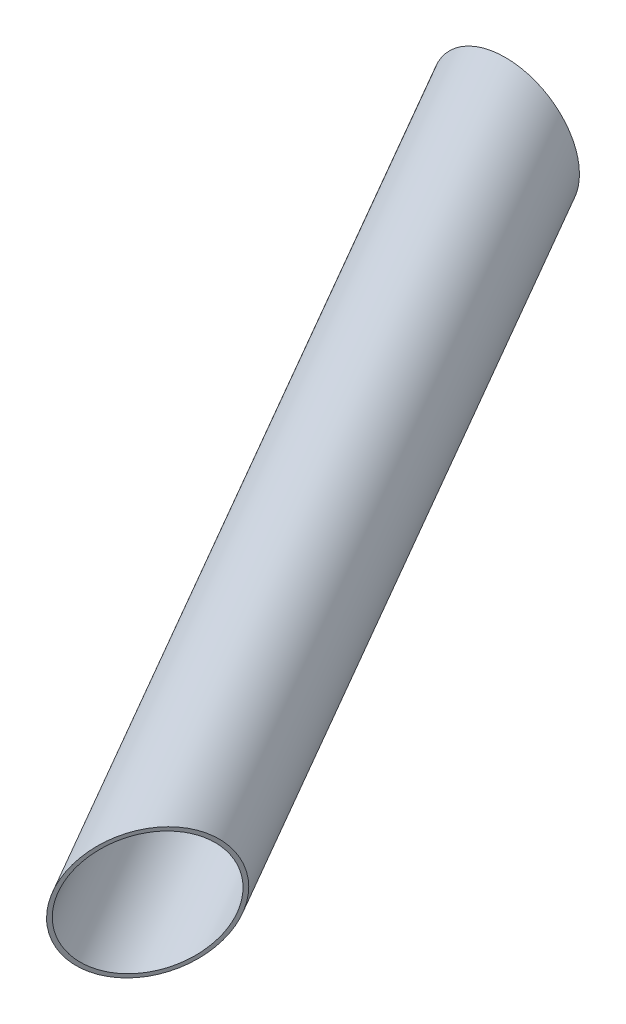
ISO-10303-21;
HEADER;
FILE_DESCRIPTION(('STEP AP214'),'2;1');
FILE_NAME('part.step','',(''),(''),'','','');
FILE_SCHEMA(('AUTOMOTIVE_DESIGN { 1 0 10303 214 1 1 1 1 }'));
ENDSEC;
DATA;
#1=APPLICATION_CONTEXT('core data for automotive mechanical design processes');
#2=APPLICATION_PROTOCOL_DEFINITION('international standard','automotive_design',2000,#1);
#3=PRODUCT_CONTEXT('',#1,'mechanical');
#4=PRODUCT('Part','Part','',(#3));
#5=PRODUCT_RELATED_PRODUCT_CATEGORY('part','',(#4));
#6=PRODUCT_DEFINITION_FORMATION('','',#4);
#7=PRODUCT_DEFINITION_CONTEXT('part definition',#1,'design');
#8=PRODUCT_DEFINITION('design','',#6,#7);
#9=PRODUCT_DEFINITION_SHAPE('','',#8);
#10=(LENGTH_UNIT() NAMED_UNIT(*) SI_UNIT(.MILLI.,.METRE.));
#11=(NAMED_UNIT(*) PLANE_ANGLE_UNIT() SI_UNIT($,.RADIAN.));
#12=(NAMED_UNIT(*) SI_UNIT($,.STERADIAN.) SOLID_ANGLE_UNIT());
#13=UNCERTAINTY_MEASURE_WITH_UNIT(LENGTH_MEASURE(1.E-05),#10,'distance_accuracy_value','');
#14=(GEOMETRIC_REPRESENTATION_CONTEXT(3) GLOBAL_UNCERTAINTY_ASSIGNED_CONTEXT((#13)) GLOBAL_UNIT_ASSIGNED_CONTEXT((#10,
#11,#12)) REPRESENTATION_CONTEXT('',''));
#15=CARTESIAN_POINT('',(0.,0.,0.));
#16=DIRECTION('',(0.,0.,1.));
#17=DIRECTION('',(1.,0.,0.));
#18=AXIS2_PLACEMENT_3D('',#15,#16,#17);
#19=CARTESIAN_POINT('',(-984.500577063095,-53.01,0.));
#20=DIRECTION('',(0.,0.,1.));
#21=DIRECTION('',(1.,0.,0.));
#22=AXIS2_PLACEMENT_3D('',#19,#20,#21);
#23=PLANE('',#22);
#24=CARTESIAN_POINT('',(-808.290376865476,0.,1.11022302462516E-13));
#25=DIRECTION('',(0.,0.,-1.));
#26=DIRECTION('',(-1.,0.,0.));
#27=AXIS2_PLACEMENT_3D('',#24,#25,#26);
#28=ELLIPSE('',#27,57.7350269189626,50.);
#29=CARTESIAN_POINT('',(-866.025403784439,0.,1.20274161001059E-13));
#30=VERTEX_POINT('',#29);
#31=EDGE_CURVE('E40',#30,#30,#28,.T.);
#32=ORIENTED_EDGE('',*,*,#31,.F.);
#33=EDGE_LOOP('',(#32));
#34=FACE_BOUND('',#33,.T.);
#35=CARTESIAN_POINT('',(-808.290376865476,0.,1.11022302462516E-13));
#36=DIRECTION('',(0.,0.,-1.));
#37=DIRECTION('',(-1.,0.,0.));
#38=AXIS2_PLACEMENT_3D('',#35,#36,#37);
#39=ELLIPSE('',#38,61.1991285341004,53.);
#40=CARTESIAN_POINT('',(-869.489505399577,0.,1.20829272513371E-13));
#41=VERTEX_POINT('',#40);
#42=EDGE_CURVE('E44',#41,#41,#39,.T.);
#43=ORIENTED_EDGE('',*,*,#42,.T.);
#44=EDGE_LOOP('',(#43));
#45=FACE_BOUND('',#44,.T.);
#46=ADVANCED_FACE('F36',(#34,#45),#23,.F.);
#47=CARTESIAN_POINT('',(0.,-53.01,0.));
#48=DIRECTION('',(-0.866025403784439,0.,-0.5));
#49=DIRECTION('',(-0.5,0.,0.866025403784439));
#50=AXIS2_PLACEMENT_3D('',#47,#48,#49);
#51=PLANE('',#50);
#52=CARTESIAN_POINT('',(-404.145188432738,0.,700.));
#53=DIRECTION('',(-0.866025403784439,0.,-0.5));
#54=DIRECTION('',(0.5,0.,-0.866025403784439));
#55=AXIS2_PLACEMENT_3D('',#52,#53,#54);
#56=ELLIPSE('',#55,61.1991285341004,53.);
#57=CARTESIAN_POINT('',(-373.545624165688,0.,647.));
#58=VERTEX_POINT('',#57);
#59=EDGE_CURVE('E11',#58,#58,#56,.F.);
#60=ORIENTED_EDGE('',*,*,#59,.T.);
#61=EDGE_LOOP('',(#60));
#62=FACE_BOUND('',#61,.T.);
#63=CARTESIAN_POINT('',(-404.145188432738,0.,700.));
#64=DIRECTION('',(-0.866025403784439,0.,-0.5));
#65=DIRECTION('',(0.5,0.,-0.866025403784439));
#66=AXIS2_PLACEMENT_3D('',#63,#64,#65);
#67=ELLIPSE('',#66,57.7350269189626,50.);
#68=CARTESIAN_POINT('',(-375.277674973257,0.,650.));
#69=VERTEX_POINT('',#68);
#70=EDGE_CURVE('E50',#69,#69,#67,.F.);
#71=ORIENTED_EDGE('',*,*,#70,.F.);
#72=EDGE_LOOP('',(#71));
#73=FACE_BOUND('',#72,.T.);
#74=ADVANCED_FACE('F38',(#62,#73),#51,.F.);
#75=CARTESIAN_POINT('',(-404.145188432738,0.,700.));
#76=DIRECTION('',(-0.5,0.,-0.866025403784439));
#77=DIRECTION('',(-0.866025403784439,0.,0.5));
#78=AXIS2_PLACEMENT_3D('',#75,#76,#77);
#79=CYLINDRICAL_SURFACE('',#78,53.);
#80=ORIENTED_EDGE('',*,*,#59,.F.);
#81=EDGE_LOOP('',(#80));
#82=FACE_BOUND('',#81,.T.);
#83=ORIENTED_EDGE('',*,*,#42,.F.);
#84=EDGE_LOOP('',(#83));
#85=FACE_BOUND('',#84,.T.);
#86=ADVANCED_FACE('F63',(#82,#85),#79,.T.);
#87=CARTESIAN_POINT('',(-404.145188432738,0.,700.));
#88=DIRECTION('',(-0.5,0.,-0.866025403784439));
#89=DIRECTION('',(-0.866025403784439,0.,0.5));
#90=AXIS2_PLACEMENT_3D('',#87,#88,#89);
#91=CYLINDRICAL_SURFACE('',#90,50.);
#92=ORIENTED_EDGE('',*,*,#70,.T.);
#93=EDGE_LOOP('',(#92));
#94=FACE_BOUND('',#93,.T.);
#95=ORIENTED_EDGE('',*,*,#31,.T.);
#96=EDGE_LOOP('',(#95));
#97=FACE_BOUND('',#96,.T.);
#98=ADVANCED_FACE('F57',(#94,#97),#91,.F.);
#99=CLOSED_SHELL('',(#46,#74,#86,#98));
#100=MANIFOLD_SOLID_BREP('B2',#99);
#101=ADVANCED_BREP_SHAPE_REPRESENTATION('',(#18,#100),#14);
#102=SHAPE_DEFINITION_REPRESENTATION(#9,#101);
ENDSEC;
END-ISO-10303-21;
